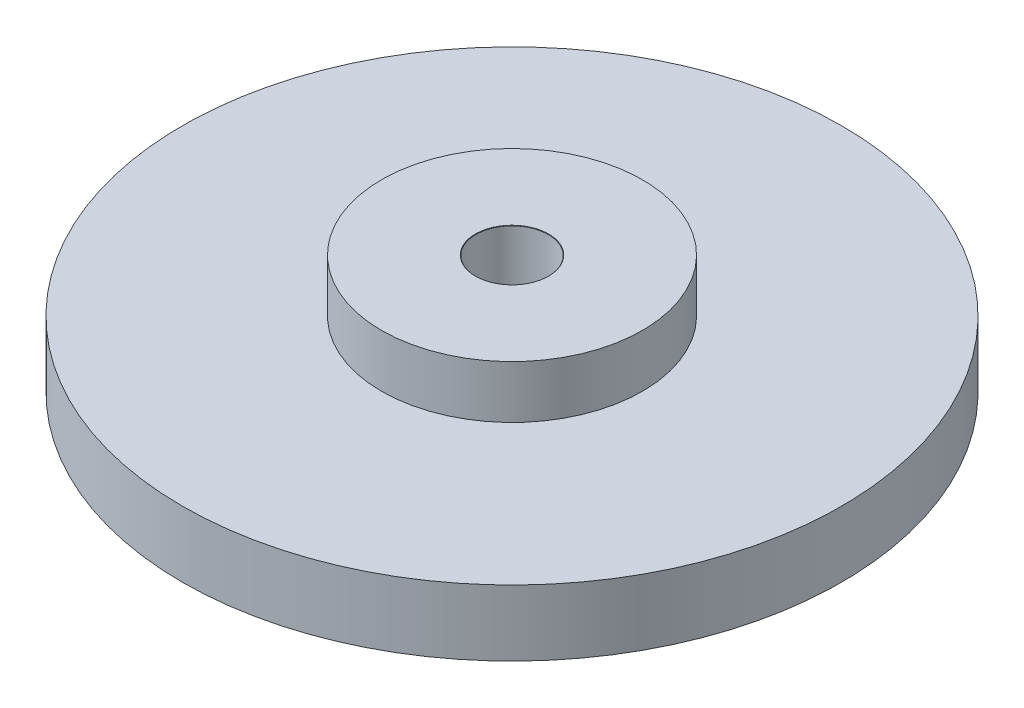
ISO-10303-21;
HEADER;
FILE_DESCRIPTION(('STEP AP214'),'2;1');
FILE_NAME('part.step','',(''),(''),'','','');
FILE_SCHEMA(('AUTOMOTIVE_DESIGN { 1 0 10303 214 1 1 1 1 }'));
ENDSEC;
DATA;
#1=APPLICATION_CONTEXT('core data for automotive mechanical design processes');
#2=APPLICATION_PROTOCOL_DEFINITION('international standard','automotive_design',2000,#1);
#3=PRODUCT_CONTEXT('',#1,'mechanical');
#4=PRODUCT('Part','Part','',(#3));
#5=PRODUCT_RELATED_PRODUCT_CATEGORY('part','',(#4));
#6=PRODUCT_DEFINITION_FORMATION('','',#4);
#7=PRODUCT_DEFINITION_CONTEXT('part definition',#1,'design');
#8=PRODUCT_DEFINITION('design','',#6,#7);
#9=PRODUCT_DEFINITION_SHAPE('','',#8);
#10=(LENGTH_UNIT() NAMED_UNIT(*) SI_UNIT(.MILLI.,.METRE.));
#11=(NAMED_UNIT(*) PLANE_ANGLE_UNIT() SI_UNIT($,.RADIAN.));
#12=(NAMED_UNIT(*) SI_UNIT($,.STERADIAN.) SOLID_ANGLE_UNIT());
#13=UNCERTAINTY_MEASURE_WITH_UNIT(LENGTH_MEASURE(1.E-05),#10,'distance_accuracy_value','');
#14=(GEOMETRIC_REPRESENTATION_CONTEXT(3) GLOBAL_UNCERTAINTY_ASSIGNED_CONTEXT((#13)) GLOBAL_UNIT_ASSIGNED_CONTEXT((#10,
#11,#12)) REPRESENTATION_CONTEXT('',''));
#15=CARTESIAN_POINT('',(0.,0.,0.));
#16=DIRECTION('',(0.,0.,1.));
#17=DIRECTION('',(1.,0.,0.));
#18=AXIS2_PLACEMENT_3D('',#15,#16,#17);
#19=CARTESIAN_POINT('',(0.,5.,0.));
#20=DIRECTION('',(0.,-1.,0.));
#21=DIRECTION('',(0.,0.,-1.));
#22=AXIS2_PLACEMENT_3D('',#19,#20,#21);
#23=CYLINDRICAL_SURFACE('',#22,25.);
#24=CARTESIAN_POINT('',(0.,5.,0.));
#25=DIRECTION('',(0.,1.,0.));
#26=DIRECTION('',(0.,0.,1.));
#27=AXIS2_PLACEMENT_3D('',#24,#25,#26);
#28=CIRCLE('',#27,25.);
#29=CARTESIAN_POINT('',(0.,5.,25.));
#30=VERTEX_POINT('',#29);
#31=EDGE_CURVE('E44',#30,#30,#28,.T.);
#32=ORIENTED_EDGE('',*,*,#31,.F.);
#33=EDGE_LOOP('',(#32));
#34=FACE_BOUND('',#33,.T.);
#35=CARTESIAN_POINT('',(0.,0.,0.));
#36=DIRECTION('',(0.,1.,0.));
#37=DIRECTION('',(0.,0.,1.));
#38=AXIS2_PLACEMENT_3D('',#35,#36,#37);
#39=CIRCLE('',#38,25.);
#40=CARTESIAN_POINT('',(0.,0.,25.));
#41=VERTEX_POINT('',#40);
#42=EDGE_CURVE('E40',#41,#41,#39,.T.);
#43=ORIENTED_EDGE('',*,*,#42,.T.);
#44=EDGE_LOOP('',(#43));
#45=FACE_BOUND('',#44,.T.);
#46=ADVANCED_FACE('F37',(#34,#45),#23,.T.);
#47=CARTESIAN_POINT('',(0.,5.,0.));
#48=DIRECTION('',(0.,1.,0.));
#49=DIRECTION('',(0.,0.,1.));
#50=AXIS2_PLACEMENT_3D('',#47,#48,#49);
#51=PLANE('',#50);
#52=CARTESIAN_POINT('',(0.,5.,0.));
#53=DIRECTION('',(0.,1.,0.));
#54=DIRECTION('',(0.,0.,1.));
#55=AXIS2_PLACEMENT_3D('',#52,#53,#54);
#56=CIRCLE('',#55,9.9);
#57=CARTESIAN_POINT('',(0.,5.,9.9));
#58=VERTEX_POINT('',#57);
#59=EDGE_CURVE('E10',#58,#58,#56,.T.);
#60=ORIENTED_EDGE('',*,*,#59,.F.);
#61=EDGE_LOOP('',(#60));
#62=FACE_BOUND('',#61,.T.);
#63=ORIENTED_EDGE('',*,*,#31,.T.);
#64=EDGE_LOOP('',(#63));
#65=FACE_BOUND('',#64,.T.);
#66=ADVANCED_FACE('F80',(#62,#65),#51,.T.);
#67=CARTESIAN_POINT('',(0.,0.,0.));
#68=DIRECTION('',(0.,1.,0.));
#69=DIRECTION('',(0.,0.,1.));
#70=AXIS2_PLACEMENT_3D('',#67,#68,#69);
#71=PLANE('',#70);
#72=CARTESIAN_POINT('',(0.,0.,0.));
#73=DIRECTION('',(0.,1.,0.));
#74=DIRECTION('',(0.,0.,1.));
#75=AXIS2_PLACEMENT_3D('',#72,#73,#74);
#76=CIRCLE('',#75,2.75);
#77=CARTESIAN_POINT('',(0.,0.,2.75));
#78=VERTEX_POINT('',#77);
#79=EDGE_CURVE('E53',#78,#78,#76,.T.);
#80=ORIENTED_EDGE('',*,*,#79,.T.);
#81=EDGE_LOOP('',(#80));
#82=FACE_BOUND('',#81,.T.);
#83=ORIENTED_EDGE('',*,*,#42,.F.);
#84=EDGE_LOOP('',(#83));
#85=FACE_BOUND('',#84,.T.);
#86=ADVANCED_FACE('F74',(#82,#85),#71,.F.);
#87=CARTESIAN_POINT('',(0.,9.,0.));
#88=DIRECTION('',(0.,-1.,0.));
#89=DIRECTION('',(0.,0.,-1.));
#90=AXIS2_PLACEMENT_3D('',#87,#88,#89);
#91=CYLINDRICAL_SURFACE('',#90,9.9);
#92=CARTESIAN_POINT('',(0.,9.,0.));
#93=DIRECTION('',(0.,1.,0.));
#94=DIRECTION('',(0.,0.,1.));
#95=AXIS2_PLACEMENT_3D('',#92,#93,#94);
#96=CIRCLE('',#95,9.9);
#97=CARTESIAN_POINT('',(0.,9.,9.9));
#98=VERTEX_POINT('',#97);
#99=EDGE_CURVE('E50',#98,#98,#96,.T.);
#100=ORIENTED_EDGE('',*,*,#99,.F.);
#101=EDGE_LOOP('',(#100));
#102=FACE_BOUND('',#101,.T.);
#103=ORIENTED_EDGE('',*,*,#59,.T.);
#104=EDGE_LOOP('',(#103));
#105=FACE_BOUND('',#104,.T.);
#106=ADVANCED_FACE('F69',(#102,#105),#91,.T.);
#107=CARTESIAN_POINT('',(0.,9.,0.));
#108=DIRECTION('',(0.,1.,0.));
#109=DIRECTION('',(0.,0.,1.));
#110=AXIS2_PLACEMENT_3D('',#107,#108,#109);
#111=PLANE('',#110);
#112=CARTESIAN_POINT('',(0.,9.,0.));
#113=DIRECTION('',(0.,1.,0.));
#114=DIRECTION('',(0.,0.,1.));
#115=AXIS2_PLACEMENT_3D('',#112,#113,#114);
#116=CIRCLE('',#115,2.775);
#117=CARTESIAN_POINT('',(0.,9.,2.775));
#118=VERTEX_POINT('',#117);
#119=EDGE_CURVE('E59',#118,#118,#116,.T.);
#120=ORIENTED_EDGE('',*,*,#119,.F.);
#121=EDGE_LOOP('',(#120));
#122=FACE_BOUND('',#121,.T.);
#123=ORIENTED_EDGE('',*,*,#99,.T.);
#124=EDGE_LOOP('',(#123));
#125=FACE_BOUND('',#124,.T.);
#126=ADVANCED_FACE('F65',(#122,#125),#111,.T.);
#127=CARTESIAN_POINT('',(0.,9.,0.));
#128=DIRECTION('',(0.,1.,0.));
#129=DIRECTION('',(0.,0.,1.));
#130=AXIS2_PLACEMENT_3D('',#127,#128,#129);
#131=CYLINDRICAL_SURFACE('',#130,2.75);
#132=ORIENTED_EDGE('',*,*,#79,.F.);
#133=EDGE_LOOP('',(#132));
#134=FACE_BOUND('',#133,.T.);
#135=CARTESIAN_POINT('',(0.,8.975,0.));
#136=DIRECTION('',(0.,1.,0.));
#137=DIRECTION('',(0.,0.,1.));
#138=AXIS2_PLACEMENT_3D('',#135,#136,#137);
#139=CIRCLE('',#138,2.75);
#140=CARTESIAN_POINT('',(0.,8.975,2.75));
#141=VERTEX_POINT('',#140);
#142=EDGE_CURVE('E56',#141,#141,#139,.T.);
#143=ORIENTED_EDGE('',*,*,#142,.T.);
#144=EDGE_LOOP('',(#143));
#145=FACE_BOUND('',#144,.T.);
#146=ADVANCED_FACE('F68',(#134,#145),#131,.F.);
#147=CARTESIAN_POINT('',(0.,9.,0.));
#148=DIRECTION('',(0.,1.,0.));
#149=DIRECTION('',(0.,0.,1.));
#150=AXIS2_PLACEMENT_3D('',#147,#148,#149);
#151=CONICAL_SURFACE('',#150,2.775,0.785398163397422);
#152=ORIENTED_EDGE('',*,*,#142,.F.);
#153=EDGE_LOOP('',(#152));
#154=FACE_BOUND('',#153,.T.);
#155=ORIENTED_EDGE('',*,*,#119,.T.);
#156=EDGE_LOOP('',(#155));
#157=FACE_BOUND('',#156,.T.);
#158=ADVANCED_FACE('F63',(#154,#157),#151,.F.);
#159=CLOSED_SHELL('',(#46,#66,#86,#106,#126,#146,#158));
#160=MANIFOLD_SOLID_BREP('B2',#159);
#161=ADVANCED_BREP_SHAPE_REPRESENTATION('',(#18,#160),#14);
#162=SHAPE_DEFINITION_REPRESENTATION(#9,#161);
ENDSEC;
END-ISO-10303-21;
